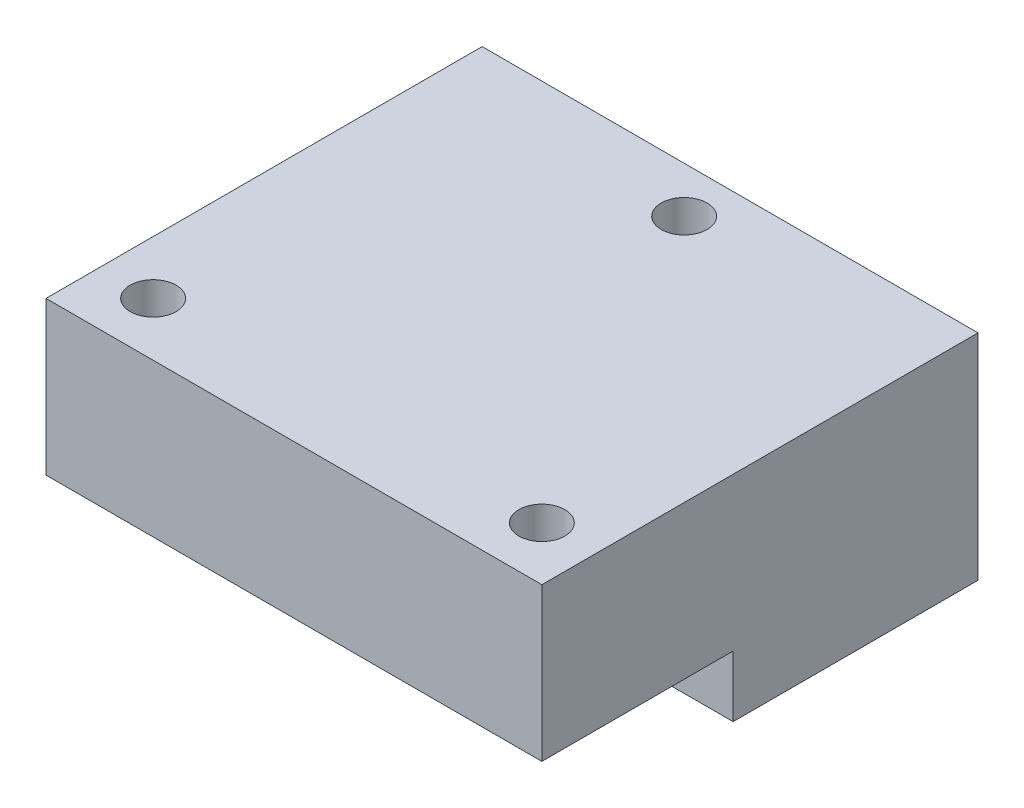
ISO-10303-21;
HEADER;
FILE_DESCRIPTION(('STEP AP214'),'2;1');
FILE_NAME('part.step','',(''),(''),'','','');
FILE_SCHEMA(('AUTOMOTIVE_DESIGN { 1 0 10303 214 1 1 1 1 }'));
ENDSEC;
DATA;
#1=APPLICATION_CONTEXT('core data for automotive mechanical design processes');
#2=APPLICATION_PROTOCOL_DEFINITION('international standard','automotive_design',2000,#1);
#3=PRODUCT_CONTEXT('',#1,'mechanical');
#4=PRODUCT('Part','Part','',(#3));
#5=PRODUCT_RELATED_PRODUCT_CATEGORY('part','',(#4));
#6=PRODUCT_DEFINITION_FORMATION('','',#4);
#7=PRODUCT_DEFINITION_CONTEXT('part definition',#1,'design');
#8=PRODUCT_DEFINITION('design','',#6,#7);
#9=PRODUCT_DEFINITION_SHAPE('','',#8);
#10=(LENGTH_UNIT() NAMED_UNIT(*) SI_UNIT(.MILLI.,.METRE.));
#11=(NAMED_UNIT(*) PLANE_ANGLE_UNIT() SI_UNIT($,.RADIAN.));
#12=(NAMED_UNIT(*) SI_UNIT($,.STERADIAN.) SOLID_ANGLE_UNIT());
#13=UNCERTAINTY_MEASURE_WITH_UNIT(LENGTH_MEASURE(1.E-05),#10,'distance_accuracy_value','');
#14=(GEOMETRIC_REPRESENTATION_CONTEXT(3) GLOBAL_UNCERTAINTY_ASSIGNED_CONTEXT((#13)) GLOBAL_UNIT_ASSIGNED_CONTEXT((#10,
#11,#12)) REPRESENTATION_CONTEXT('',''));
#15=CARTESIAN_POINT('',(0.,0.,0.));
#16=DIRECTION('',(0.,0.,1.));
#17=DIRECTION('',(1.,0.,0.));
#18=AXIS2_PLACEMENT_3D('',#15,#16,#17);
#19=CARTESIAN_POINT('',(0.,0.,0.));
#20=DIRECTION('',(0.,1.,0.));
#21=DIRECTION('',(1.,0.,0.));
#22=AXIS2_PLACEMENT_3D('',#19,#20,#21);
#23=PLANE('',#22);
#24=DIRECTION('',(0.,0.,1.));
#25=VECTOR('',#24,1.);
#26=CARTESIAN_POINT('',(-16.2,0.,-1.6646968374165));
#27=LINE('',#26,#25);
#28=CARTESIAN_POINT('',(-16.2,0.,-1.66469683741649));
#29=VERTEX_POINT('',#28);
#30=CARTESIAN_POINT('',(-16.2,0.,10.8323484187083));
#31=VERTEX_POINT('',#30);
#32=EDGE_CURVE('E40',#29,#31,#27,.T.);
#33=ORIENTED_EDGE('',*,*,#32,.F.);
#34=DIRECTION('',(1.,0.,0.));
#35=VECTOR('',#34,1.);
#36=CARTESIAN_POINT('',(-16.2,0.,-1.66469683741649));
#37=LINE('',#36,#35);
#38=CARTESIAN_POINT('',(16.2,0.,-1.66469683741649));
#39=VERTEX_POINT('',#38);
#40=EDGE_CURVE('E11',#29,#39,#37,.T.);
#41=ORIENTED_EDGE('',*,*,#40,.T.);
#42=DIRECTION('',(0.,0.,-1.));
#43=VECTOR('',#42,1.);
#44=CARTESIAN_POINT('',(16.2,0.,10.8323484187082));
#45=LINE('',#44,#43);
#46=CARTESIAN_POINT('',(16.2,0.,10.8323484187083));
#47=VERTEX_POINT('',#46);
#48=EDGE_CURVE('E65',#47,#39,#45,.T.);
#49=ORIENTED_EDGE('',*,*,#48,.F.);
#50=DIRECTION('',(1.,0.,0.));
#51=VECTOR('',#50,1.);
#52=CARTESIAN_POINT('',(-16.2,0.,10.8323484187083));
#53=LINE('',#52,#51);
#54=EDGE_CURVE('E73',#31,#47,#53,.T.);
#55=ORIENTED_EDGE('',*,*,#54,.F.);
#56=EDGE_LOOP('',(#33,#41,#49,#55));
#57=FACE_BOUND('',#56,.T.);
#58=DIRECTION('',(1.,0.,0.));
#59=VECTOR('',#58,1.);
#60=CARTESIAN_POINT('',(-6.5,0.,-0.164696837416493));
#61=LINE('',#60,#59);
#62=CARTESIAN_POINT('',(-6.5,0.,-0.164696837416493));
#63=VERTEX_POINT('',#62);
#64=CARTESIAN_POINT('',(6.5,0.,-0.164696837416493));
#65=VERTEX_POINT('',#64);
#66=EDGE_CURVE('E263',#63,#65,#61,.T.);
#67=ORIENTED_EDGE('',*,*,#66,.F.);
#68=DIRECTION('',(0.,0.,-1.));
#69=VECTOR('',#68,1.);
#70=CARTESIAN_POINT('',(-6.5,0.,3.83530316258351));
#71=LINE('',#70,#69);
#72=CARTESIAN_POINT('',(-6.5,0.,3.83530316258351));
#73=VERTEX_POINT('',#72);
#74=EDGE_CURVE('E201',#73,#63,#71,.T.);
#75=ORIENTED_EDGE('',*,*,#74,.F.);
#76=DIRECTION('',(1.,0.,0.));
#77=VECTOR('',#76,1.);
#78=CARTESIAN_POINT('',(-6.5,0.,3.83530316258351));
#79=LINE('',#78,#77);
#80=CARTESIAN_POINT('',(6.5,0.,3.83530316258351));
#81=VERTEX_POINT('',#80);
#82=EDGE_CURVE('E27',#73,#81,#79,.T.);
#83=ORIENTED_EDGE('',*,*,#82,.T.);
#84=DIRECTION('',(0.,0.,-1.));
#85=VECTOR('',#84,1.);
#86=CARTESIAN_POINT('',(6.5,0.,3.83530316258351));
#87=LINE('',#86,#85);
#88=EDGE_CURVE('E220',#81,#65,#87,.T.);
#89=ORIENTED_EDGE('',*,*,#88,.T.);
#90=EDGE_LOOP('',(#67,#75,#83,#89));
#91=FACE_BOUND('',#90,.T.);
#92=CARTESIAN_POINT('',(-12.7,0.,7.33234841870826));
#93=DIRECTION('',(0.,1.,0.));
#94=DIRECTION('',(0.,0.,1.));
#95=AXIS2_PLACEMENT_3D('',#92,#93,#94);
#96=CIRCLE('',#95,1.5);
#97=CARTESIAN_POINT('',(-12.7,0.,8.83234841870826));
#98=VERTEX_POINT('',#97);
#99=EDGE_CURVE('E259',#98,#98,#96,.T.);
#100=ORIENTED_EDGE('',*,*,#99,.T.);
#101=EDGE_LOOP('',(#100));
#102=FACE_BOUND('',#101,.T.);
#103=CARTESIAN_POINT('',(12.7,0.,7.33234841870824));
#104=DIRECTION('',(0.,1.,0.));
#105=DIRECTION('',(0.,0.,1.));
#106=AXIS2_PLACEMENT_3D('',#103,#104,#105);
#107=CIRCLE('',#106,1.5);
#108=CARTESIAN_POINT('',(12.7,0.,8.83234841870825));
#109=VERTEX_POINT('',#108);
#110=EDGE_CURVE('E187',#109,#109,#107,.T.);
#111=ORIENTED_EDGE('',*,*,#110,.T.);
#112=EDGE_LOOP('',(#111));
#113=FACE_BOUND('',#112,.T.);
#114=ADVANCED_FACE('F16',(#57,#91,#102,#113),#23,.F.);
#115=CARTESIAN_POINT('',(0.,0.,0.));
#116=DIRECTION('',(0.,1.,0.));
#117=DIRECTION('',(1.,0.,0.));
#118=AXIS2_PLACEMENT_3D('',#115,#116,#117);
#119=PLANE('',#118);
#120=DIRECTION('',(0.,0.,-1.));
#121=VECTOR('',#120,1.);
#122=CARTESIAN_POINT('',(4.,0.,-11.6646968374165));
#123=LINE('',#122,#121);
#124=CARTESIAN_POINT('',(4.,0.,-11.6646968374165));
#125=VERTEX_POINT('',#124);
#126=CARTESIAN_POINT('',(4.,0.,-17.6646968374165));
#127=VERTEX_POINT('',#126);
#128=EDGE_CURVE('E278',#125,#127,#123,.T.);
#129=ORIENTED_EDGE('',*,*,#128,.F.);
#130=DIRECTION('',(1.,0.,0.));
#131=VECTOR('',#130,1.);
#132=CARTESIAN_POINT('',(-4.,0.,-11.6646968374165));
#133=LINE('',#132,#131);
#134=CARTESIAN_POINT('',(-4.,0.,-11.6646968374165));
#135=VERTEX_POINT('',#134);
#136=EDGE_CURVE('E277',#135,#125,#133,.T.);
#137=ORIENTED_EDGE('',*,*,#136,.F.);
#138=DIRECTION('',(0.,0.,-1.));
#139=VECTOR('',#138,1.);
#140=CARTESIAN_POINT('',(-4.,0.,-11.6646968374165));
#141=LINE('',#140,#139);
#142=CARTESIAN_POINT('',(-4.,0.,-17.6646968374165));
#143=VERTEX_POINT('',#142);
#144=EDGE_CURVE('E178',#135,#143,#141,.T.);
#145=ORIENTED_EDGE('',*,*,#144,.T.);
#146=DIRECTION('',(-1.,0.,0.));
#147=VECTOR('',#146,1.);
#148=CARTESIAN_POINT('',(4.,0.,-17.6646968374165));
#149=LINE('',#148,#147);
#150=EDGE_CURVE('E216',#127,#143,#149,.T.);
#151=ORIENTED_EDGE('',*,*,#150,.F.);
#152=EDGE_LOOP('',(#129,#137,#145,#151));
#153=FACE_BOUND('',#152,.T.);
#154=CARTESIAN_POINT('',(0.,0.,-14.6646968374165));
#155=DIRECTION('',(0.,1.,0.));
#156=DIRECTION('',(0.,0.,1.));
#157=AXIS2_PLACEMENT_3D('',#154,#155,#156);
#158=CIRCLE('',#157,1.5);
#159=CARTESIAN_POINT('',(0.,0.,-13.1646968374165));
#160=VERTEX_POINT('',#159);
#161=EDGE_CURVE('E172',#160,#160,#158,.T.);
#162=ORIENTED_EDGE('',*,*,#161,.T.);
#163=EDGE_LOOP('',(#162));
#164=FACE_BOUND('',#163,.T.);
#165=ADVANCED_FACE('F406',(#153,#164),#119,.F.);
#166=CARTESIAN_POINT('',(0.,10.,0.));
#167=DIRECTION('',(0.,1.,0.));
#168=DIRECTION('',(1.,0.,0.));
#169=AXIS2_PLACEMENT_3D('',#166,#167,#168);
#170=PLANE('',#169);
#171=DIRECTION('',(0.,0.,1.));
#172=VECTOR('',#171,1.);
#173=CARTESIAN_POINT('',(-16.2,10.,-17.6646968374165));
#174=LINE('',#173,#172);
#175=CARTESIAN_POINT('',(-16.2,10.,-17.6646968374165));
#176=VERTEX_POINT('',#175);
#177=CARTESIAN_POINT('',(-16.2,10.,10.8323484187083));
#178=VERTEX_POINT('',#177);
#179=EDGE_CURVE('E179',#176,#178,#174,.T.);
#180=ORIENTED_EDGE('',*,*,#179,.T.);
#181=DIRECTION('',(1.,0.,0.));
#182=VECTOR('',#181,1.);
#183=CARTESIAN_POINT('',(-16.2,10.,10.8323484187083));
#184=LINE('',#183,#182);
#185=CARTESIAN_POINT('',(16.2,10.,10.8323484187083));
#186=VERTEX_POINT('',#185);
#187=EDGE_CURVE('E190',#178,#186,#184,.T.);
#188=ORIENTED_EDGE('',*,*,#187,.T.);
#189=DIRECTION('',(0.,0.,-1.));
#190=VECTOR('',#189,1.);
#191=CARTESIAN_POINT('',(16.2,10.,10.8323484187082));
#192=LINE('',#191,#190);
#193=CARTESIAN_POINT('',(16.2,10.,-17.6646968374165));
#194=VERTEX_POINT('',#193);
#195=EDGE_CURVE('E20',#186,#194,#192,.T.);
#196=ORIENTED_EDGE('',*,*,#195,.T.);
#197=DIRECTION('',(-1.,0.,0.));
#198=VECTOR('',#197,1.);
#199=CARTESIAN_POINT('',(16.2,10.,-17.6646968374165));
#200=LINE('',#199,#198);
#201=EDGE_CURVE('E254',#194,#176,#200,.T.);
#202=ORIENTED_EDGE('',*,*,#201,.T.);
#203=EDGE_LOOP('',(#180,#188,#196,#202));
#204=FACE_BOUND('',#203,.T.);
#205=CARTESIAN_POINT('',(12.7,10.,7.33234841870824));
#206=DIRECTION('',(0.,1.,0.));
#207=DIRECTION('',(0.,0.,1.));
#208=AXIS2_PLACEMENT_3D('',#205,#206,#207);
#209=CIRCLE('',#208,1.5);
#210=CARTESIAN_POINT('',(12.7,10.,8.83234841870825));
#211=VERTEX_POINT('',#210);
#212=EDGE_CURVE('E240',#211,#211,#209,.T.);
#213=ORIENTED_EDGE('',*,*,#212,.F.);
#214=EDGE_LOOP('',(#213));
#215=FACE_BOUND('',#214,.T.);
#216=CARTESIAN_POINT('',(0.,10.,-14.6646968374165));
#217=DIRECTION('',(0.,1.,0.));
#218=DIRECTION('',(0.,0.,1.));
#219=AXIS2_PLACEMENT_3D('',#216,#217,#218);
#220=CIRCLE('',#219,1.5);
#221=CARTESIAN_POINT('',(0.,10.,-13.1646968374165));
#222=VERTEX_POINT('',#221);
#223=EDGE_CURVE('E267',#222,#222,#220,.T.);
#224=ORIENTED_EDGE('',*,*,#223,.F.);
#225=EDGE_LOOP('',(#224));
#226=FACE_BOUND('',#225,.T.);
#227=CARTESIAN_POINT('',(-12.7,10.,7.33234841870826));
#228=DIRECTION('',(0.,1.,0.));
#229=DIRECTION('',(0.,0.,1.));
#230=AXIS2_PLACEMENT_3D('',#227,#228,#229);
#231=CIRCLE('',#230,1.5);
#232=CARTESIAN_POINT('',(-12.7,10.,8.83234841870826));
#233=VERTEX_POINT('',#232);
#234=EDGE_CURVE('E294',#233,#233,#231,.T.);
#235=ORIENTED_EDGE('',*,*,#234,.F.);
#236=EDGE_LOOP('',(#235));
#237=FACE_BOUND('',#236,.T.);
#238=ADVANCED_FACE('F390',(#204,#215,#226,#237),#170,.T.);
#239=CARTESIAN_POINT('',(-16.2,10.,-17.6646968374165));
#240=DIRECTION('',(1.,0.,0.));
#241=DIRECTION('',(0.,1.,0.));
#242=AXIS2_PLACEMENT_3D('',#239,#240,#241);
#243=PLANE('',#242);
#244=DIRECTION('',(0.,-1.,0.));
#245=VECTOR('',#244,1.);
#246=CARTESIAN_POINT('',(-16.2,10.,-17.6646968374165));
#247=LINE('',#246,#245);
#248=CARTESIAN_POINT('',(-16.2,-4.,-17.6646968374165));
#249=VERTEX_POINT('',#248);
#250=EDGE_CURVE('E250',#176,#249,#247,.T.);
#251=ORIENTED_EDGE('',*,*,#250,.T.);
#252=DIRECTION('',(0.,0.,-1.));
#253=VECTOR('',#252,1.);
#254=CARTESIAN_POINT('',(-16.2,-4.,-1.66469683741649));
#255=LINE('',#254,#253);
#256=CARTESIAN_POINT('',(-16.2,-4.,-1.66469683741649));
#257=VERTEX_POINT('',#256);
#258=EDGE_CURVE('E224',#257,#249,#255,.T.);
#259=ORIENTED_EDGE('',*,*,#258,.F.);
#260=DIRECTION('',(0.,1.,0.));
#261=VECTOR('',#260,1.);
#262=CARTESIAN_POINT('',(-16.2,-4.,-1.66469683741649));
#263=LINE('',#262,#261);
#264=EDGE_CURVE('E255',#257,#29,#263,.T.);
#265=ORIENTED_EDGE('',*,*,#264,.T.);
#266=ORIENTED_EDGE('',*,*,#32,.T.);
#267=DIRECTION('',(0.,-1.,0.));
#268=VECTOR('',#267,1.);
#269=CARTESIAN_POINT('',(-16.2,10.,10.8323484187083));
#270=LINE('',#269,#268);
#271=EDGE_CURVE('E207',#178,#31,#270,.T.);
#272=ORIENTED_EDGE('',*,*,#271,.F.);
#273=ORIENTED_EDGE('',*,*,#179,.F.);
#274=EDGE_LOOP('',(#251,#259,#265,#266,#272,#273));
#275=FACE_BOUND('',#274,.T.);
#276=ADVANCED_FACE('F365',(#275),#243,.F.);
#277=CARTESIAN_POINT('',(-16.2,10.,10.8323484187083));
#278=DIRECTION('',(0.,0.,-1.));
#279=DIRECTION('',(0.,-1.,0.));
#280=AXIS2_PLACEMENT_3D('',#277,#278,#279);
#281=PLANE('',#280);
#282=ORIENTED_EDGE('',*,*,#54,.T.);
#283=DIRECTION('',(0.,-1.,0.));
#284=VECTOR('',#283,1.);
#285=CARTESIAN_POINT('',(16.2,10.,10.8323484187083));
#286=LINE('',#285,#284);
#287=EDGE_CURVE('E323',#186,#47,#286,.T.);
#288=ORIENTED_EDGE('',*,*,#287,.F.);
#289=ORIENTED_EDGE('',*,*,#187,.F.);
#290=ORIENTED_EDGE('',*,*,#271,.T.);
#291=EDGE_LOOP('',(#282,#288,#289,#290));
#292=FACE_BOUND('',#291,.T.);
#293=ADVANCED_FACE('F393',(#292),#281,.F.);
#294=CARTESIAN_POINT('',(16.2,10.,-17.6646968374165));
#295=DIRECTION('',(-1.,0.,0.));
#296=DIRECTION('',(0.,1.,0.));
#297=AXIS2_PLACEMENT_3D('',#294,#295,#296);
#298=PLANE('',#297);
#299=ORIENTED_EDGE('',*,*,#48,.T.);
#300=DIRECTION('',(0.,1.,0.));
#301=VECTOR('',#300,1.);
#302=CARTESIAN_POINT('',(16.2,-4.,-1.66469683741649));
#303=LINE('',#302,#301);
#304=CARTESIAN_POINT('',(16.2,-4.,-1.66469683741649));
#305=VERTEX_POINT('',#304);
#306=EDGE_CURVE('E194',#305,#39,#303,.T.);
#307=ORIENTED_EDGE('',*,*,#306,.F.);
#308=DIRECTION('',(0.,0.,1.));
#309=VECTOR('',#308,1.);
#310=CARTESIAN_POINT('',(16.2,-4.,-17.6646968374165));
#311=LINE('',#310,#309);
#312=CARTESIAN_POINT('',(16.2,-4.,-17.6646968374165));
#313=VERTEX_POINT('',#312);
#314=EDGE_CURVE('E234',#313,#305,#311,.T.);
#315=ORIENTED_EDGE('',*,*,#314,.F.);
#316=DIRECTION('',(0.,-1.,0.));
#317=VECTOR('',#316,1.);
#318=CARTESIAN_POINT('',(16.2,10.,-17.6646968374165));
#319=LINE('',#318,#317);
#320=EDGE_CURVE('E215',#194,#313,#319,.T.);
#321=ORIENTED_EDGE('',*,*,#320,.F.);
#322=ORIENTED_EDGE('',*,*,#195,.F.);
#323=ORIENTED_EDGE('',*,*,#287,.T.);
#324=EDGE_LOOP('',(#299,#307,#315,#321,#322,#323));
#325=FACE_BOUND('',#324,.T.);
#326=ADVANCED_FACE('F359',(#325),#298,.F.);
#327=CARTESIAN_POINT('',(-16.2,10.,-17.6646968374165));
#328=DIRECTION('',(0.,0.,1.));
#329=DIRECTION('',(1.,0.,0.));
#330=AXIS2_PLACEMENT_3D('',#327,#328,#329);
#331=PLANE('',#330);
#332=ORIENTED_EDGE('',*,*,#320,.T.);
#333=DIRECTION('',(1.,0.,0.));
#334=VECTOR('',#333,1.);
#335=CARTESIAN_POINT('',(4.,-4.,-17.6646968374165));
#336=LINE('',#335,#334);
#337=CARTESIAN_POINT('',(4.,-4.,-17.6646968374165));
#338=VERTEX_POINT('',#337);
#339=EDGE_CURVE('E229',#338,#313,#336,.T.);
#340=ORIENTED_EDGE('',*,*,#339,.F.);
#341=DIRECTION('',(0.,1.,0.));
#342=VECTOR('',#341,1.);
#343=CARTESIAN_POINT('',(4.,-4.,-17.6646968374165));
#344=LINE('',#343,#342);
#345=EDGE_CURVE('E211',#338,#127,#344,.T.);
#346=ORIENTED_EDGE('',*,*,#345,.T.);
#347=ORIENTED_EDGE('',*,*,#150,.T.);
#348=DIRECTION('',(0.,1.,0.));
#349=VECTOR('',#348,1.);
#350=CARTESIAN_POINT('',(-4.,-4.,-17.6646968374165));
#351=LINE('',#350,#349);
#352=CARTESIAN_POINT('',(-4.,-4.,-17.6646968374165));
#353=VERTEX_POINT('',#352);
#354=EDGE_CURVE('E239',#353,#143,#351,.T.);
#355=ORIENTED_EDGE('',*,*,#354,.F.);
#356=DIRECTION('',(1.,0.,0.));
#357=VECTOR('',#356,1.);
#358=CARTESIAN_POINT('',(-16.2,-4.,-17.6646968374165));
#359=LINE('',#358,#357);
#360=EDGE_CURVE('E221',#249,#353,#359,.T.);
#361=ORIENTED_EDGE('',*,*,#360,.F.);
#362=ORIENTED_EDGE('',*,*,#250,.F.);
#363=ORIENTED_EDGE('',*,*,#201,.F.);
#364=EDGE_LOOP('',(#332,#340,#346,#347,#355,#361,#362,#363));
#365=FACE_BOUND('',#364,.T.);
#366=ADVANCED_FACE('F374',(#365),#331,.F.);
#367=CARTESIAN_POINT('',(12.7,10.,7.33234841870824));
#368=DIRECTION('',(0.,-1.,0.));
#369=DIRECTION('',(0.,0.,-1.));
#370=AXIS2_PLACEMENT_3D('',#367,#368,#369);
#371=CYLINDRICAL_SURFACE('',#370,1.5);
#372=ORIENTED_EDGE('',*,*,#212,.T.);
#373=DIRECTION('',(0.,-1.,0.));
#374=VECTOR('',#373,1.);
#375=CARTESIAN_POINT('',(12.7,10.,8.83234841870824));
#376=LINE('',#375,#374);
#377=EDGE_CURVE('E244',#211,#109,#376,.T.);
#378=ORIENTED_EDGE('',*,*,#377,.T.);
#379=ORIENTED_EDGE('',*,*,#110,.F.);
#380=ORIENTED_EDGE('',*,*,#377,.F.);
#381=EDGE_LOOP('',(#372,#378,#379,#380));
#382=FACE_BOUND('',#381,.T.);
#383=ADVANCED_FACE('F416',(#382),#371,.F.);
#384=CARTESIAN_POINT('',(-12.7,10.,7.33234841870826));
#385=DIRECTION('',(0.,-1.,0.));
#386=DIRECTION('',(0.,0.,-1.));
#387=AXIS2_PLACEMENT_3D('',#384,#385,#386);
#388=CYLINDRICAL_SURFACE('',#387,1.5);
#389=ORIENTED_EDGE('',*,*,#234,.T.);
#390=DIRECTION('',(0.,-1.,0.));
#391=VECTOR('',#390,1.);
#392=CARTESIAN_POINT('',(-12.7,10.,8.83234841870826));
#393=LINE('',#392,#391);
#394=EDGE_CURVE('E270',#233,#98,#393,.T.);
#395=ORIENTED_EDGE('',*,*,#394,.T.);
#396=ORIENTED_EDGE('',*,*,#99,.F.);
#397=ORIENTED_EDGE('',*,*,#394,.F.);
#398=EDGE_LOOP('',(#389,#395,#396,#397));
#399=FACE_BOUND('',#398,.T.);
#400=ADVANCED_FACE('F419',(#399),#388,.F.);
#401=CARTESIAN_POINT('',(0.,10.,-14.6646968374165));
#402=DIRECTION('',(0.,-1.,0.));
#403=DIRECTION('',(0.,0.,-1.));
#404=AXIS2_PLACEMENT_3D('',#401,#402,#403);
#405=CYLINDRICAL_SURFACE('',#404,1.5);
#406=ORIENTED_EDGE('',*,*,#223,.T.);
#407=DIRECTION('',(0.,-1.,0.));
#408=VECTOR('',#407,1.);
#409=CARTESIAN_POINT('',(0.,10.,-13.1646968374165));
#410=LINE('',#409,#408);
#411=EDGE_CURVE('E175',#222,#160,#410,.T.);
#412=ORIENTED_EDGE('',*,*,#411,.T.);
#413=ORIENTED_EDGE('',*,*,#161,.F.);
#414=ORIENTED_EDGE('',*,*,#411,.F.);
#415=EDGE_LOOP('',(#406,#412,#413,#414));
#416=FACE_BOUND('',#415,.T.);
#417=ADVANCED_FACE('F174',(#416),#405,.F.);
#418=CARTESIAN_POINT('',(0.,-4.,-1.66469683741649));
#419=DIRECTION('',(0.,0.,1.));
#420=DIRECTION('',(1.,0.,0.));
#421=AXIS2_PLACEMENT_3D('',#418,#419,#420);
#422=PLANE('',#421);
#423=ORIENTED_EDGE('',*,*,#40,.F.);
#424=ORIENTED_EDGE('',*,*,#264,.F.);
#425=DIRECTION('',(1.,0.,0.));
#426=VECTOR('',#425,1.);
#427=CARTESIAN_POINT('',(-16.2,-4.,-1.66469683741649));
#428=LINE('',#427,#426);
#429=EDGE_CURVE('E299',#257,#305,#428,.T.);
#430=ORIENTED_EDGE('',*,*,#429,.T.);
#431=ORIENTED_EDGE('',*,*,#306,.T.);
#432=EDGE_LOOP('',(#423,#424,#430,#431));
#433=FACE_BOUND('',#432,.T.);
#434=ADVANCED_FACE('F363',(#433),#422,.T.);
#435=CARTESIAN_POINT('',(-4.,-4.,0.));
#436=DIRECTION('',(1.,0.,0.));
#437=DIRECTION('',(0.,0.,1.));
#438=AXIS2_PLACEMENT_3D('',#435,#436,#437);
#439=PLANE('',#438);
#440=ORIENTED_EDGE('',*,*,#144,.F.);
#441=DIRECTION('',(0.,1.,0.));
#442=VECTOR('',#441,1.);
#443=CARTESIAN_POINT('',(-4.,-4.,-11.6646968374165));
#444=LINE('',#443,#442);
#445=CARTESIAN_POINT('',(-4.,-4.,-11.6646968374165));
#446=VERTEX_POINT('',#445);
#447=EDGE_CURVE('E273',#446,#135,#444,.T.);
#448=ORIENTED_EDGE('',*,*,#447,.F.);
#449=DIRECTION('',(0.,0.,-1.));
#450=VECTOR('',#449,1.);
#451=CARTESIAN_POINT('',(-4.,-4.,-11.6646968374165));
#452=LINE('',#451,#450);
#453=EDGE_CURVE('E235',#446,#353,#452,.T.);
#454=ORIENTED_EDGE('',*,*,#453,.T.);
#455=ORIENTED_EDGE('',*,*,#354,.T.);
#456=EDGE_LOOP('',(#440,#448,#454,#455));
#457=FACE_BOUND('',#456,.T.);
#458=ADVANCED_FACE('F378',(#457),#439,.T.);
#459=CARTESIAN_POINT('',(0.,-4.,-11.6646968374165));
#460=DIRECTION('',(0.,0.,1.));
#461=DIRECTION('',(1.,0.,0.));
#462=AXIS2_PLACEMENT_3D('',#459,#460,#461);
#463=PLANE('',#462);
#464=ORIENTED_EDGE('',*,*,#136,.T.);
#465=DIRECTION('',(0.,1.,0.));
#466=VECTOR('',#465,1.);
#467=CARTESIAN_POINT('',(4.,-4.,-11.6646968374165));
#468=LINE('',#467,#466);
#469=CARTESIAN_POINT('',(4.,-4.,-11.6646968374165));
#470=VERTEX_POINT('',#469);
#471=EDGE_CURVE('E285',#470,#125,#468,.T.);
#472=ORIENTED_EDGE('',*,*,#471,.F.);
#473=DIRECTION('',(1.,0.,0.));
#474=VECTOR('',#473,1.);
#475=CARTESIAN_POINT('',(-4.,-4.,-11.6646968374165));
#476=LINE('',#475,#474);
#477=EDGE_CURVE('E225',#446,#470,#476,.T.);
#478=ORIENTED_EDGE('',*,*,#477,.F.);
#479=ORIENTED_EDGE('',*,*,#447,.T.);
#480=EDGE_LOOP('',(#464,#472,#478,#479));
#481=FACE_BOUND('',#480,.T.);
#482=ADVANCED_FACE('F380',(#481),#463,.F.);
#483=CARTESIAN_POINT('',(4.,-4.,0.));
#484=DIRECTION('',(1.,0.,0.));
#485=DIRECTION('',(0.,1.,0.));
#486=AXIS2_PLACEMENT_3D('',#483,#484,#485);
#487=PLANE('',#486);
#488=ORIENTED_EDGE('',*,*,#128,.T.);
#489=ORIENTED_EDGE('',*,*,#345,.F.);
#490=DIRECTION('',(0.,0.,-1.));
#491=VECTOR('',#490,1.);
#492=CARTESIAN_POINT('',(4.,-4.,-11.6646968374165));
#493=LINE('',#492,#491);
#494=EDGE_CURVE('E233',#470,#338,#493,.T.);
#495=ORIENTED_EDGE('',*,*,#494,.F.);
#496=ORIENTED_EDGE('',*,*,#471,.T.);
#497=EDGE_LOOP('',(#488,#489,#495,#496));
#498=FACE_BOUND('',#497,.T.);
#499=ADVANCED_FACE('F385',(#498),#487,.F.);
#500=CARTESIAN_POINT('',(0.,-4.,0.));
#501=DIRECTION('',(0.,-1.,0.));
#502=DIRECTION('',(0.,0.,-1.));
#503=AXIS2_PLACEMENT_3D('',#500,#501,#502);
#504=PLANE('',#503);
#505=ORIENTED_EDGE('',*,*,#429,.F.);
#506=ORIENTED_EDGE('',*,*,#258,.T.);
#507=ORIENTED_EDGE('',*,*,#360,.T.);
#508=ORIENTED_EDGE('',*,*,#453,.F.);
#509=ORIENTED_EDGE('',*,*,#477,.T.);
#510=ORIENTED_EDGE('',*,*,#494,.T.);
#511=ORIENTED_EDGE('',*,*,#339,.T.);
#512=ORIENTED_EDGE('',*,*,#314,.T.);
#513=EDGE_LOOP('',(#505,#506,#507,#508,#509,#510,#511,#512));
#514=FACE_BOUND('',#513,.T.);
#515=ADVANCED_FACE('F354',(#514),#504,.T.);
#516=CARTESIAN_POINT('',(-6.5,-4.,-0.164696837416493));
#517=DIRECTION('',(0.,0.,1.));
#518=DIRECTION('',(1.,0.,0.));
#519=AXIS2_PLACEMENT_3D('',#516,#517,#518);
#520=PLANE('',#519);
#521=ORIENTED_EDGE('',*,*,#66,.T.);
#522=DIRECTION('',(0.,1.,0.));
#523=VECTOR('',#522,1.);
#524=CARTESIAN_POINT('',(6.5,-4.,-0.164696837416493));
#525=LINE('',#524,#523);
#526=CARTESIAN_POINT('',(6.5,-4.,-0.164696837416493));
#527=VERTEX_POINT('',#526);
#528=EDGE_CURVE('E245',#527,#65,#525,.T.);
#529=ORIENTED_EDGE('',*,*,#528,.F.);
#530=DIRECTION('',(1.,0.,0.));
#531=VECTOR('',#530,1.);
#532=CARTESIAN_POINT('',(-6.5,-4.,-0.164696837416493));
#533=LINE('',#532,#531);
#534=CARTESIAN_POINT('',(-6.5,-4.,-0.164696837416493));
#535=VERTEX_POINT('',#534);
#536=EDGE_CURVE('E202',#535,#527,#533,.T.);
#537=ORIENTED_EDGE('',*,*,#536,.F.);
#538=DIRECTION('',(0.,1.,0.));
#539=VECTOR('',#538,1.);
#540=CARTESIAN_POINT('',(-6.5,-4.,-0.164696837416493));
#541=LINE('',#540,#539);
#542=EDGE_CURVE('E266',#535,#63,#541,.T.);
#543=ORIENTED_EDGE('',*,*,#542,.T.);
#544=EDGE_LOOP('',(#521,#529,#537,#543));
#545=FACE_BOUND('',#544,.T.);
#546=ADVANCED_FACE('F18',(#545),#520,.F.);
#547=CARTESIAN_POINT('',(6.5,-4.,3.83530316258351));
#548=DIRECTION('',(1.,0.,0.));
#549=DIRECTION('',(0.,0.,1.));
#550=AXIS2_PLACEMENT_3D('',#547,#548,#549);
#551=PLANE('',#550);
#552=ORIENTED_EDGE('',*,*,#88,.F.);
#553=DIRECTION('',(0.,1.,0.));
#554=VECTOR('',#553,1.);
#555=CARTESIAN_POINT('',(6.5,-4.,3.83530316258351));
#556=LINE('',#555,#554);
#557=CARTESIAN_POINT('',(6.5,-4.,3.83530316258351));
#558=VERTEX_POINT('',#557);
#559=EDGE_CURVE('E196',#558,#81,#556,.T.);
#560=ORIENTED_EDGE('',*,*,#559,.F.);
#561=DIRECTION('',(0.,0.,-1.));
#562=VECTOR('',#561,1.);
#563=CARTESIAN_POINT('',(6.5,-4.,3.83530316258351));
#564=LINE('',#563,#562);
#565=EDGE_CURVE('E249',#558,#527,#564,.T.);
#566=ORIENTED_EDGE('',*,*,#565,.T.);
#567=ORIENTED_EDGE('',*,*,#528,.T.);
#568=EDGE_LOOP('',(#552,#560,#566,#567));
#569=FACE_BOUND('',#568,.T.);
#570=ADVANCED_FACE('F440',(#569),#551,.T.);
#571=CARTESIAN_POINT('',(-6.5,-4.,3.83530316258351));
#572=DIRECTION('',(0.,0.,1.));
#573=DIRECTION('',(1.,0.,0.));
#574=AXIS2_PLACEMENT_3D('',#571,#572,#573);
#575=PLANE('',#574);
#576=ORIENTED_EDGE('',*,*,#82,.F.);
#577=DIRECTION('',(0.,1.,0.));
#578=VECTOR('',#577,1.);
#579=CARTESIAN_POINT('',(-6.5,-4.,3.83530316258351));
#580=LINE('',#579,#578);
#581=CARTESIAN_POINT('',(-6.5,-4.,3.83530316258351));
#582=VERTEX_POINT('',#581);
#583=EDGE_CURVE('E205',#582,#73,#580,.T.);
#584=ORIENTED_EDGE('',*,*,#583,.F.);
#585=DIRECTION('',(1.,0.,0.));
#586=VECTOR('',#585,1.);
#587=CARTESIAN_POINT('',(-6.5,-4.,3.83530316258351));
#588=LINE('',#587,#586);
#589=EDGE_CURVE('E200',#582,#558,#588,.T.);
#590=ORIENTED_EDGE('',*,*,#589,.T.);
#591=ORIENTED_EDGE('',*,*,#559,.T.);
#592=EDGE_LOOP('',(#576,#584,#590,#591));
#593=FACE_BOUND('',#592,.T.);
#594=ADVANCED_FACE('F433',(#593),#575,.T.);
#595=CARTESIAN_POINT('',(-6.5,-4.,3.83530316258351));
#596=DIRECTION('',(1.,0.,0.));
#597=DIRECTION('',(0.,1.,0.));
#598=AXIS2_PLACEMENT_3D('',#595,#596,#597);
#599=PLANE('',#598);
#600=ORIENTED_EDGE('',*,*,#74,.T.);
#601=ORIENTED_EDGE('',*,*,#542,.F.);
#602=DIRECTION('',(0.,0.,-1.));
#603=VECTOR('',#602,1.);
#604=CARTESIAN_POINT('',(-6.5,-4.,3.83530316258351));
#605=LINE('',#604,#603);
#606=EDGE_CURVE('E206',#582,#535,#605,.T.);
#607=ORIENTED_EDGE('',*,*,#606,.F.);
#608=ORIENTED_EDGE('',*,*,#583,.T.);
#609=EDGE_LOOP('',(#600,#601,#607,#608));
#610=FACE_BOUND('',#609,.T.);
#611=ADVANCED_FACE('F429',(#610),#599,.F.);
#612=CARTESIAN_POINT('',(0.,-4.,0.));
#613=DIRECTION('',(0.,1.,0.));
#614=DIRECTION('',(1.,0.,0.));
#615=AXIS2_PLACEMENT_3D('',#612,#613,#614);
#616=PLANE('',#615);
#617=ORIENTED_EDGE('',*,*,#536,.T.);
#618=ORIENTED_EDGE('',*,*,#565,.F.);
#619=ORIENTED_EDGE('',*,*,#589,.F.);
#620=ORIENTED_EDGE('',*,*,#606,.T.);
#621=EDGE_LOOP('',(#617,#618,#619,#620));
#622=FACE_BOUND('',#621,.T.);
#623=ADVANCED_FACE('F432',(#622),#616,.F.);
#624=CLOSED_SHELL('',(#114,#165,#238,#276,#293,#326,#366,#383,#400,#417,#434,#458,#482,#499,
#515,#546,#570,#594,#611,#623));
#625=MANIFOLD_SOLID_BREP('B1',#624);
#626=ADVANCED_BREP_SHAPE_REPRESENTATION('',(#18,#625),#14);
#627=SHAPE_DEFINITION_REPRESENTATION(#9,#626);
ENDSEC;
END-ISO-10303-21;
